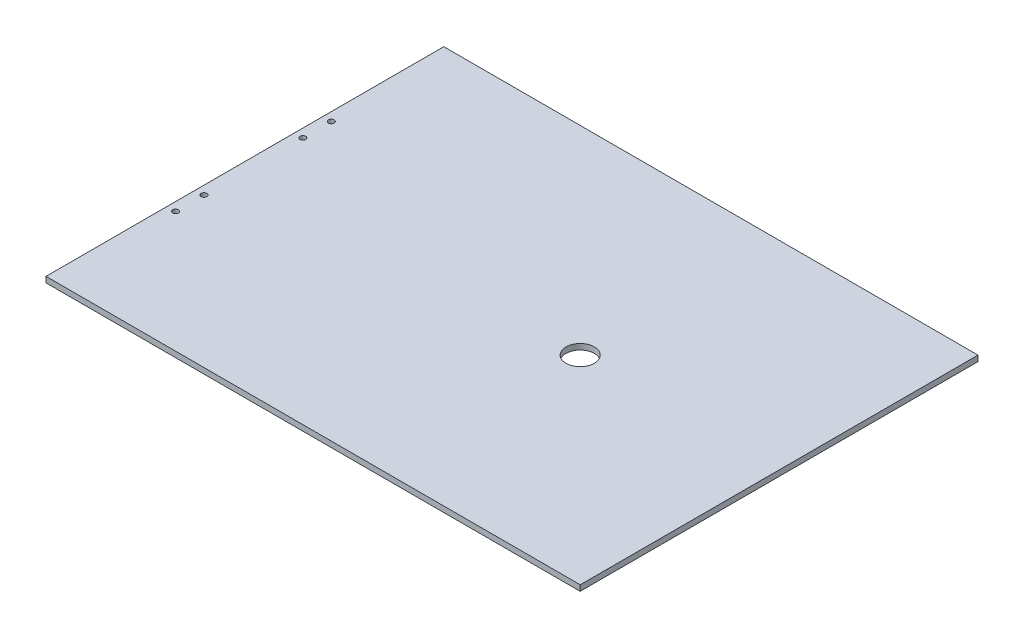
ISO-10303-21;
HEADER;
FILE_DESCRIPTION(('STEP AP214'),'2;1');
FILE_NAME('part.step','',(''),(''),'','','');
FILE_SCHEMA(('AUTOMOTIVE_DESIGN { 1 0 10303 214 1 1 1 1 }'));
ENDSEC;
DATA;
#1=APPLICATION_CONTEXT('core data for automotive mechanical design processes');
#2=APPLICATION_PROTOCOL_DEFINITION('international standard','automotive_design',2000,#1);
#3=PRODUCT_CONTEXT('',#1,'mechanical');
#4=PRODUCT('Part','Part','',(#3));
#5=PRODUCT_RELATED_PRODUCT_CATEGORY('part','',(#4));
#6=PRODUCT_DEFINITION_FORMATION('','',#4);
#7=PRODUCT_DEFINITION_CONTEXT('part definition',#1,'design');
#8=PRODUCT_DEFINITION('design','',#6,#7);
#9=PRODUCT_DEFINITION_SHAPE('','',#8);
#10=(LENGTH_UNIT() NAMED_UNIT(*) SI_UNIT(.MILLI.,.METRE.));
#11=(NAMED_UNIT(*) PLANE_ANGLE_UNIT() SI_UNIT($,.RADIAN.));
#12=(NAMED_UNIT(*) SI_UNIT($,.STERADIAN.) SOLID_ANGLE_UNIT());
#13=UNCERTAINTY_MEASURE_WITH_UNIT(LENGTH_MEASURE(1.E-05),#10,'distance_accuracy_value','');
#14=(GEOMETRIC_REPRESENTATION_CONTEXT(3) GLOBAL_UNCERTAINTY_ASSIGNED_CONTEXT((#13)) GLOBAL_UNIT_ASSIGNED_CONTEXT((#10,
#11,#12)) REPRESENTATION_CONTEXT('',''));
#15=CARTESIAN_POINT('',(0.,0.,0.));
#16=DIRECTION('',(0.,0.,1.));
#17=DIRECTION('',(1.,0.,0.));
#18=AXIS2_PLACEMENT_3D('',#15,#16,#17);
#19=CARTESIAN_POINT('',(0.,5.,0.));
#20=DIRECTION('',(0.,1.,0.));
#21=DIRECTION('',(0.,0.,1.));
#22=AXIS2_PLACEMENT_3D('',#19,#20,#21);
#23=PLANE('',#22);
#24=CARTESIAN_POINT('',(-287.5,5.,68.5000001527369));
#25=DIRECTION('',(0.,1.,0.));
#26=DIRECTION('',(0.,0.,1.));
#27=AXIS2_PLACEMENT_3D('',#24,#25,#26);
#28=CIRCLE('',#27,2.49999999999997);
#29=CARTESIAN_POINT('',(-287.5,5.,71.0000001527368));
#30=VERTEX_POINT('',#29);
#31=EDGE_CURVE('E314',#30,#30,#28,.T.);
#32=ORIENTED_EDGE('',*,*,#31,.F.);
#33=EDGE_LOOP('',(#32));
#34=FACE_BOUND('',#33,.T.);
#35=CARTESIAN_POINT('',(-287.500000000001,5.,-43.5000001527368));
#36=DIRECTION('',(0.,-1.,0.));
#37=DIRECTION('',(0.,0.,-1.));
#38=AXIS2_PLACEMENT_3D('',#35,#36,#37);
#39=CIRCLE('',#38,2.50000000000002);
#40=CARTESIAN_POINT('',(-287.500000000001,5.,-46.0000001527369));
#41=VERTEX_POINT('',#40);
#42=EDGE_CURVE('E315',#41,#41,#39,.T.);
#43=ORIENTED_EDGE('',*,*,#42,.T.);
#44=EDGE_LOOP('',(#43));
#45=FACE_BOUND('',#44,.T.);
#46=CARTESIAN_POINT('',(-287.500000000001,5.,43.5000001527369));
#47=DIRECTION('',(0.,1.,0.));
#48=DIRECTION('',(0.,0.,1.));
#49=AXIS2_PLACEMENT_3D('',#46,#47,#48);
#50=CIRCLE('',#49,2.50000000000005);
#51=CARTESIAN_POINT('',(-287.500000000001,5.,46.0000001527369));
#52=VERTEX_POINT('',#51);
#53=EDGE_CURVE('E146',#52,#52,#50,.T.);
#54=ORIENTED_EDGE('',*,*,#53,.F.);
#55=EDGE_LOOP('',(#54));
#56=FACE_BOUND('',#55,.T.);
#57=DIRECTION('',(0.,0.,-1.));
#58=VECTOR('',#57,1.);
#59=CARTESIAN_POINT('',(175.,5.,-175.));
#60=LINE('',#59,#58);
#61=CARTESIAN_POINT('',(175.,5.,175.));
#62=VERTEX_POINT('',#61);
#63=CARTESIAN_POINT('',(175.,5.,-175.));
#64=VERTEX_POINT('',#63);
#65=EDGE_CURVE('E92',#62,#64,#60,.T.);
#66=ORIENTED_EDGE('',*,*,#65,.T.);
#67=DIRECTION('',(-1.,0.,0.));
#68=VECTOR('',#67,1.);
#69=CARTESIAN_POINT('',(-175.,5.,-175.));
#70=LINE('',#69,#68);
#71=CARTESIAN_POINT('',(-295.,5.,-175.));
#72=VERTEX_POINT('',#71);
#73=EDGE_CURVE('E86',#64,#72,#70,.T.);
#74=ORIENTED_EDGE('',*,*,#73,.T.);
#75=DIRECTION('',(0.,0.,1.));
#76=VECTOR('',#75,1.);
#77=CARTESIAN_POINT('',(-295.,5.,-175.));
#78=LINE('',#77,#76);
#79=CARTESIAN_POINT('',(-295.,5.,175.));
#80=VERTEX_POINT('',#79);
#81=EDGE_CURVE('E90',#72,#80,#78,.T.);
#82=ORIENTED_EDGE('',*,*,#81,.T.);
#83=DIRECTION('',(1.,0.,0.));
#84=VECTOR('',#83,1.);
#85=CARTESIAN_POINT('',(-175.,5.,175.));
#86=LINE('',#85,#84);
#87=EDGE_CURVE('E62',#80,#62,#86,.T.);
#88=ORIENTED_EDGE('',*,*,#87,.T.);
#89=EDGE_LOOP('',(#66,#74,#82,#88));
#90=FACE_BOUND('',#89,.T.);
#91=CARTESIAN_POINT('',(0.,5.,0.));
#92=DIRECTION('',(0.,1.,0.));
#93=DIRECTION('',(0.,0.,1.));
#94=AXIS2_PLACEMENT_3D('',#91,#92,#93);
#95=CIRCLE('',#94,12.5);
#96=CARTESIAN_POINT('',(0.,5.,12.5));
#97=VERTEX_POINT('',#96);
#98=EDGE_CURVE('E118',#97,#97,#95,.T.);
#99=ORIENTED_EDGE('',*,*,#98,.F.);
#100=EDGE_LOOP('',(#99));
#101=FACE_BOUND('',#100,.T.);
#102=CARTESIAN_POINT('',(-287.500000000001,5.,-68.5000001527369));
#103=DIRECTION('',(0.,-1.,0.));
#104=DIRECTION('',(0.,0.,-1.));
#105=AXIS2_PLACEMENT_3D('',#102,#103,#104);
#106=CIRCLE('',#105,2.49999999999992);
#107=CARTESIAN_POINT('',(-287.500000000001,5.,-71.0000001527368));
#108=VERTEX_POINT('',#107);
#109=EDGE_CURVE('E312',#108,#108,#106,.T.);
#110=ORIENTED_EDGE('',*,*,#109,.T.);
#111=EDGE_LOOP('',(#110));
#112=FACE_BOUND('',#111,.T.);
#113=ADVANCED_FACE('F42',(#34,#45,#56,#90,#101,#112),#23,.T.);
#114=CARTESIAN_POINT('',(0.,0.,0.));
#115=DIRECTION('',(0.,1.,0.));
#116=DIRECTION('',(0.,0.,1.));
#117=AXIS2_PLACEMENT_3D('',#114,#115,#116);
#118=PLANE('',#117);
#119=CARTESIAN_POINT('',(-287.5,0.,68.5000001527369));
#120=DIRECTION('',(0.,1.,0.));
#121=DIRECTION('',(0.,0.,1.));
#122=AXIS2_PLACEMENT_3D('',#119,#120,#121);
#123=CIRCLE('',#122,2.49999999999997);
#124=CARTESIAN_POINT('',(-287.5,0.,71.0000001527368));
#125=VERTEX_POINT('',#124);
#126=EDGE_CURVE('E46',#125,#125,#123,.T.);
#127=ORIENTED_EDGE('',*,*,#126,.T.);
#128=EDGE_LOOP('',(#127));
#129=FACE_BOUND('',#128,.T.);
#130=CARTESIAN_POINT('',(-287.500000000001,0.,43.5000001527369));
#131=DIRECTION('',(0.,1.,0.));
#132=DIRECTION('',(0.,0.,1.));
#133=AXIS2_PLACEMENT_3D('',#130,#131,#132);
#134=CIRCLE('',#133,2.50000000000005);
#135=CARTESIAN_POINT('',(-287.500000000001,0.,46.0000001527369));
#136=VERTEX_POINT('',#135);
#137=EDGE_CURVE('E141',#136,#136,#134,.T.);
#138=ORIENTED_EDGE('',*,*,#137,.T.);
#139=EDGE_LOOP('',(#138));
#140=FACE_BOUND('',#139,.T.);
#141=DIRECTION('',(0.,0.,-1.));
#142=VECTOR('',#141,1.);
#143=CARTESIAN_POINT('',(175.,0.,-175.));
#144=LINE('',#143,#142);
#145=CARTESIAN_POINT('',(175.,0.,175.));
#146=VERTEX_POINT('',#145);
#147=CARTESIAN_POINT('',(175.,0.,-175.));
#148=VERTEX_POINT('',#147);
#149=EDGE_CURVE('E122',#146,#148,#144,.T.);
#150=ORIENTED_EDGE('',*,*,#149,.F.);
#151=DIRECTION('',(1.,0.,0.));
#152=VECTOR('',#151,1.);
#153=CARTESIAN_POINT('',(-175.,0.,175.));
#154=LINE('',#153,#152);
#155=CARTESIAN_POINT('',(-295.,0.,175.));
#156=VERTEX_POINT('',#155);
#157=EDGE_CURVE('E78',#156,#146,#154,.T.);
#158=ORIENTED_EDGE('',*,*,#157,.F.);
#159=DIRECTION('',(0.,0.,-1.));
#160=VECTOR('',#159,1.);
#161=CARTESIAN_POINT('',(-295.,0.,-175.));
#162=LINE('',#161,#160);
#163=CARTESIAN_POINT('',(-295.,0.,-175.));
#164=VERTEX_POINT('',#163);
#165=EDGE_CURVE('E114',#156,#164,#162,.T.);
#166=ORIENTED_EDGE('',*,*,#165,.T.);
#167=DIRECTION('',(-1.,0.,0.));
#168=VECTOR('',#167,1.);
#169=CARTESIAN_POINT('',(-175.,0.,-175.));
#170=LINE('',#169,#168);
#171=EDGE_CURVE('E74',#148,#164,#170,.T.);
#172=ORIENTED_EDGE('',*,*,#171,.F.);
#173=EDGE_LOOP('',(#150,#158,#166,#172));
#174=FACE_BOUND('',#173,.T.);
#175=CARTESIAN_POINT('',(0.,0.,0.));
#176=DIRECTION('',(0.,1.,0.));
#177=DIRECTION('',(0.,0.,1.));
#178=AXIS2_PLACEMENT_3D('',#175,#176,#177);
#179=CIRCLE('',#178,12.5);
#180=CARTESIAN_POINT('',(0.,0.,12.5));
#181=VERTEX_POINT('',#180);
#182=EDGE_CURVE('E123',#181,#181,#179,.T.);
#183=ORIENTED_EDGE('',*,*,#182,.T.);
#184=EDGE_LOOP('',(#183));
#185=FACE_BOUND('',#184,.T.);
#186=CARTESIAN_POINT('',(-287.500000000001,0.,-43.5000001527368));
#187=DIRECTION('',(0.,1.,0.));
#188=DIRECTION('',(0.,0.,1.));
#189=AXIS2_PLACEMENT_3D('',#186,#187,#188);
#190=CIRCLE('',#189,2.50000000000002);
#191=CARTESIAN_POINT('',(-287.500000000001,0.,-41.0000001527368));
#192=VERTEX_POINT('',#191);
#193=EDGE_CURVE('E145',#192,#192,#190,.F.);
#194=ORIENTED_EDGE('',*,*,#193,.F.);
#195=EDGE_LOOP('',(#194));
#196=FACE_BOUND('',#195,.T.);
#197=CARTESIAN_POINT('',(-287.500000000001,0.,-68.5000001527369));
#198=DIRECTION('',(0.,1.,0.));
#199=DIRECTION('',(0.,0.,1.));
#200=AXIS2_PLACEMENT_3D('',#197,#198,#199);
#201=CIRCLE('',#200,2.49999999999992);
#202=CARTESIAN_POINT('',(-287.500000000001,0.,-66.000000152737));
#203=VERTEX_POINT('',#202);
#204=EDGE_CURVE('E111',#203,#203,#201,.F.);
#205=ORIENTED_EDGE('',*,*,#204,.F.);
#206=EDGE_LOOP('',(#205));
#207=FACE_BOUND('',#206,.T.);
#208=ADVANCED_FACE('F155',(#129,#140,#174,#185,#196,#207),#118,.F.);
#209=CARTESIAN_POINT('',(175.,5.,-175.));
#210=DIRECTION('',(-1.,0.,0.));
#211=DIRECTION('',(0.,0.,1.));
#212=AXIS2_PLACEMENT_3D('',#209,#210,#211);
#213=PLANE('',#212);
#214=ORIENTED_EDGE('',*,*,#149,.T.);
#215=DIRECTION('',(0.,-1.,0.));
#216=VECTOR('',#215,1.);
#217=CARTESIAN_POINT('',(175.,5.,-175.));
#218=LINE('',#217,#216);
#219=EDGE_CURVE('E11',#64,#148,#218,.T.);
#220=ORIENTED_EDGE('',*,*,#219,.F.);
#221=ORIENTED_EDGE('',*,*,#65,.F.);
#222=DIRECTION('',(0.,-1.,0.));
#223=VECTOR('',#222,1.);
#224=CARTESIAN_POINT('',(175.,5.,175.));
#225=LINE('',#224,#223);
#226=EDGE_CURVE('E53',#62,#146,#225,.T.);
#227=ORIENTED_EDGE('',*,*,#226,.T.);
#228=EDGE_LOOP('',(#214,#220,#221,#227));
#229=FACE_BOUND('',#228,.T.);
#230=ADVANCED_FACE('F44',(#229),#213,.F.);
#231=CARTESIAN_POINT('',(-175.,5.,-175.));
#232=DIRECTION('',(0.,0.,1.));
#233=DIRECTION('',(1.,0.,0.));
#234=AXIS2_PLACEMENT_3D('',#231,#232,#233);
#235=PLANE('',#234);
#236=ORIENTED_EDGE('',*,*,#171,.T.);
#237=DIRECTION('',(0.,1.,0.));
#238=VECTOR('',#237,1.);
#239=CARTESIAN_POINT('',(-295.,-370.,-175.));
#240=LINE('',#239,#238);
#241=EDGE_CURVE('E98',#164,#72,#240,.T.);
#242=ORIENTED_EDGE('',*,*,#241,.T.);
#243=ORIENTED_EDGE('',*,*,#73,.F.);
#244=ORIENTED_EDGE('',*,*,#219,.T.);
#245=EDGE_LOOP('',(#236,#242,#243,#244));
#246=FACE_BOUND('',#245,.T.);
#247=ADVANCED_FACE('F99',(#246),#235,.F.);
#248=CARTESIAN_POINT('',(-175.,5.,175.));
#249=DIRECTION('',(0.,0.,-1.));
#250=DIRECTION('',(-1.,0.,0.));
#251=AXIS2_PLACEMENT_3D('',#248,#249,#250);
#252=PLANE('',#251);
#253=ORIENTED_EDGE('',*,*,#157,.T.);
#254=ORIENTED_EDGE('',*,*,#226,.F.);
#255=ORIENTED_EDGE('',*,*,#87,.F.);
#256=DIRECTION('',(0.,1.,0.));
#257=VECTOR('',#256,1.);
#258=CARTESIAN_POINT('',(-295.,-370.,175.));
#259=LINE('',#258,#257);
#260=EDGE_CURVE('E102',#156,#80,#259,.T.);
#261=ORIENTED_EDGE('',*,*,#260,.F.);
#262=EDGE_LOOP('',(#253,#254,#255,#261));
#263=FACE_BOUND('',#262,.T.);
#264=ADVANCED_FACE('F170',(#263),#252,.F.);
#265=CARTESIAN_POINT('',(0.,5.,0.));
#266=DIRECTION('',(0.,-1.,0.));
#267=DIRECTION('',(0.,0.,-1.));
#268=AXIS2_PLACEMENT_3D('',#265,#266,#267);
#269=CYLINDRICAL_SURFACE('',#268,12.5);
#270=ORIENTED_EDGE('',*,*,#98,.T.);
#271=EDGE_LOOP('',(#270));
#272=FACE_BOUND('',#271,.T.);
#273=ORIENTED_EDGE('',*,*,#182,.F.);
#274=EDGE_LOOP('',(#273));
#275=FACE_BOUND('',#274,.T.);
#276=ADVANCED_FACE('F172',(#272,#275),#269,.F.);
#277=CARTESIAN_POINT('',(-295.,-370.,-175.));
#278=DIRECTION('',(-1.,0.,0.));
#279=DIRECTION('',(0.,0.,1.));
#280=AXIS2_PLACEMENT_3D('',#277,#278,#279);
#281=PLANE('',#280);
#282=ORIENTED_EDGE('',*,*,#165,.F.);
#283=ORIENTED_EDGE('',*,*,#260,.T.);
#284=ORIENTED_EDGE('',*,*,#81,.F.);
#285=ORIENTED_EDGE('',*,*,#241,.F.);
#286=EDGE_LOOP('',(#282,#283,#284,#285));
#287=FACE_BOUND('',#286,.T.);
#288=ADVANCED_FACE('F105',(#287),#281,.T.);
#289=CARTESIAN_POINT('',(-287.500000000001,-5.,43.5000001527369));
#290=DIRECTION('',(0.,1.,0.));
#291=DIRECTION('',(0.,0.,1.));
#292=AXIS2_PLACEMENT_3D('',#289,#290,#291);
#293=CYLINDRICAL_SURFACE('',#292,2.50000000000005);
#294=ORIENTED_EDGE('',*,*,#53,.T.);
#295=EDGE_LOOP('',(#294));
#296=FACE_BOUND('',#295,.T.);
#297=ORIENTED_EDGE('',*,*,#137,.F.);
#298=EDGE_LOOP('',(#297));
#299=FACE_BOUND('',#298,.T.);
#300=ADVANCED_FACE('F187',(#296,#299),#293,.F.);
#301=CARTESIAN_POINT('',(-287.500000000001,-5.,-43.5000001527368));
#302=DIRECTION('',(0.,1.,0.));
#303=DIRECTION('',(0.,0.,1.));
#304=AXIS2_PLACEMENT_3D('',#301,#302,#303);
#305=CYLINDRICAL_SURFACE('',#304,2.50000000000002);
#306=ORIENTED_EDGE('',*,*,#42,.F.);
#307=EDGE_LOOP('',(#306));
#308=FACE_BOUND('',#307,.T.);
#309=ORIENTED_EDGE('',*,*,#193,.T.);
#310=EDGE_LOOP('',(#309));
#311=FACE_BOUND('',#310,.T.);
#312=ADVANCED_FACE('F195',(#308,#311),#305,.F.);
#313=CARTESIAN_POINT('',(-287.500000000001,-5.,-68.5000001527369));
#314=DIRECTION('',(0.,1.,0.));
#315=DIRECTION('',(0.,0.,1.));
#316=AXIS2_PLACEMENT_3D('',#313,#314,#315);
#317=CYLINDRICAL_SURFACE('',#316,2.49999999999992);
#318=ORIENTED_EDGE('',*,*,#109,.F.);
#319=EDGE_LOOP('',(#318));
#320=FACE_BOUND('',#319,.T.);
#321=ORIENTED_EDGE('',*,*,#204,.T.);
#322=EDGE_LOOP('',(#321));
#323=FACE_BOUND('',#322,.T.);
#324=ADVANCED_FACE('F153',(#320,#323),#317,.F.);
#325=CARTESIAN_POINT('',(-287.5,-5.,68.5000001527369));
#326=DIRECTION('',(0.,1.,0.));
#327=DIRECTION('',(0.,0.,1.));
#328=AXIS2_PLACEMENT_3D('',#325,#326,#327);
#329=CYLINDRICAL_SURFACE('',#328,2.49999999999997);
#330=ORIENTED_EDGE('',*,*,#31,.T.);
#331=EDGE_LOOP('',(#330));
#332=FACE_BOUND('',#331,.T.);
#333=ORIENTED_EDGE('',*,*,#126,.F.);
#334=EDGE_LOOP('',(#333));
#335=FACE_BOUND('',#334,.T.);
#336=ADVANCED_FACE('F210',(#332,#335),#329,.F.);
#337=CLOSED_SHELL('',(#113,#208,#230,#247,#264,#276,#288,#300,#312,#324,#336));
#338=MANIFOLD_SOLID_BREP('B2',#337);
#339=ADVANCED_BREP_SHAPE_REPRESENTATION('',(#18,#338),#14);
#340=SHAPE_DEFINITION_REPRESENTATION(#9,#339);
ENDSEC;
END-ISO-10303-21;
